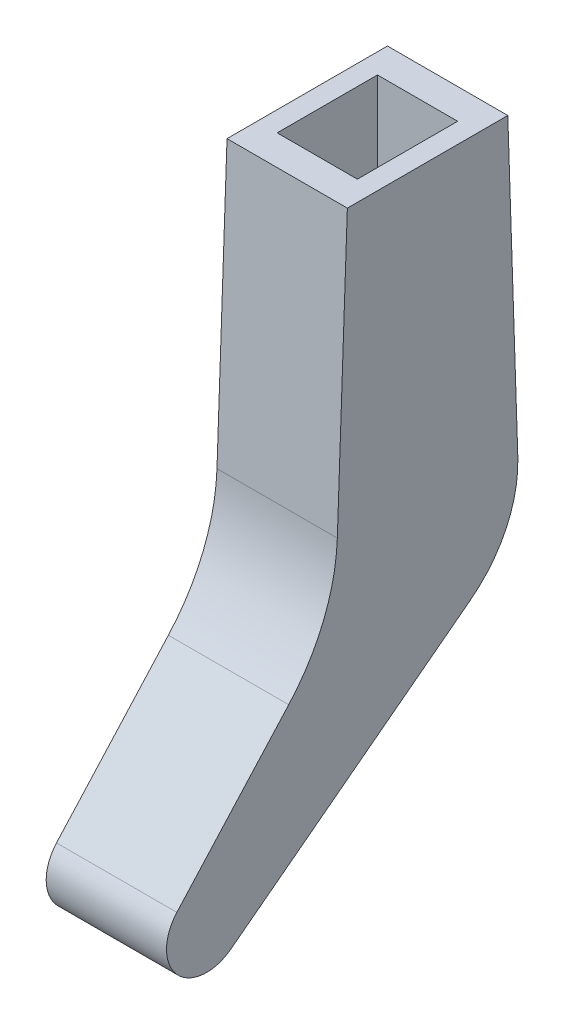
ISO-10303-21;
HEADER;
FILE_DESCRIPTION(('STEP AP214'),'2;1');
FILE_NAME('part.step','',(''),(''),'','','');
FILE_SCHEMA(('AUTOMOTIVE_DESIGN { 1 0 10303 214 1 1 1 1 }'));
ENDSEC;
DATA;
#1=APPLICATION_CONTEXT('core data for automotive mechanical design processes');
#2=APPLICATION_PROTOCOL_DEFINITION('international standard','automotive_design',2000,#1);
#3=PRODUCT_CONTEXT('',#1,'mechanical');
#4=PRODUCT('Part','Part','',(#3));
#5=PRODUCT_RELATED_PRODUCT_CATEGORY('part','',(#4));
#6=PRODUCT_DEFINITION_FORMATION('','',#4);
#7=PRODUCT_DEFINITION_CONTEXT('part definition',#1,'design');
#8=PRODUCT_DEFINITION('design','',#6,#7);
#9=PRODUCT_DEFINITION_SHAPE('','',#8);
#10=(LENGTH_UNIT() NAMED_UNIT(*) SI_UNIT(.MILLI.,.METRE.));
#11=(NAMED_UNIT(*) PLANE_ANGLE_UNIT() SI_UNIT($,.RADIAN.));
#12=(NAMED_UNIT(*) SI_UNIT($,.STERADIAN.) SOLID_ANGLE_UNIT());
#13=UNCERTAINTY_MEASURE_WITH_UNIT(LENGTH_MEASURE(1.E-05),#10,'distance_accuracy_value','');
#14=(GEOMETRIC_REPRESENTATION_CONTEXT(3) GLOBAL_UNCERTAINTY_ASSIGNED_CONTEXT((#13)) GLOBAL_UNIT_ASSIGNED_CONTEXT((#10,
#11,#12)) REPRESENTATION_CONTEXT('',''));
#15=CARTESIAN_POINT('',(0.,0.,0.));
#16=DIRECTION('',(0.,0.,1.));
#17=DIRECTION('',(1.,0.,0.));
#18=AXIS2_PLACEMENT_3D('',#15,#16,#17);
#19=CARTESIAN_POINT('',(4.,-14.7042352060567,-11.203607359622));
#20=DIRECTION('',(0.,0.795421796600104,0.606056239546681));
#21=DIRECTION('',(0.,-0.606056239546681,0.795421796600104));
#22=AXIS2_PLACEMENT_3D('',#19,#20,#21);
#23=PLANE('',#22);
#24=DIRECTION('',(-1.,0.,0.));
#25=VECTOR('',#24,1.);
#26=CARTESIAN_POINT('',(4.,-38.1816871864004,19.6095017468296));
#27=LINE('',#26,#25);
#28=CARTESIAN_POINT('',(6.,-38.1816871864004,19.6095017468296));
#29=VERTEX_POINT('',#28);
#30=CARTESIAN_POINT('',(-6.,-38.1816871864004,19.6095017468296));
#31=VERTEX_POINT('',#30);
#32=EDGE_CURVE('E200',#29,#31,#27,.T.);
#33=ORIENTED_EDGE('',*,*,#32,.T.);
#34=DIRECTION('',(0.,0.606056239546681,-0.795421796600103));
#35=VECTOR('',#34,1.);
#36=CARTESIAN_POINT('',(-6.,-14.7042352060567,-11.203607359622));
#37=LINE('',#36,#35);
#38=CARTESIAN_POINT('',(-6.,-20.,-4.25315215117348));
#39=VERTEX_POINT('',#38);
#40=EDGE_CURVE('E164',#31,#39,#37,.T.);
#41=ORIENTED_EDGE('',*,*,#40,.T.);
#42=DIRECTION('',(-1.,0.,0.));
#43=VECTOR('',#42,1.);
#44=CARTESIAN_POINT('',(4.,-20.,-4.25315215117349));
#45=LINE('',#44,#43);
#46=CARTESIAN_POINT('',(6.,-20.,-4.25315215117349));
#47=VERTEX_POINT('',#46);
#48=EDGE_CURVE('E11',#47,#39,#45,.T.);
#49=ORIENTED_EDGE('',*,*,#48,.F.);
#50=DIRECTION('',(0.,-0.606056239546681,0.795421796600103));
#51=VECTOR('',#50,1.);
#52=CARTESIAN_POINT('',(6.,-14.7042352060567,-11.203607359622));
#53=LINE('',#52,#51);
#54=EDGE_CURVE('E188',#47,#29,#53,.T.);
#55=ORIENTED_EDGE('',*,*,#54,.T.);
#56=EDGE_LOOP('',(#33,#41,#49,#55));
#57=FACE_BOUND('',#56,.T.);
#58=ADVANCED_FACE('F34',(#57),#23,.F.);
#59=CARTESIAN_POINT('',(4.,-10.4019953885707,3.05986165712048));
#60=DIRECTION('',(-1.,0.,0.));
#61=DIRECTION('',(0.,0.,1.));
#62=AXIS2_PLACEMENT_3D('',#59,#60,#61);
#63=CYLINDRICAL_SURFACE('',#62,12.0665597202068);
#64=ORIENTED_EDGE('',*,*,#48,.T.);
#65=CARTESIAN_POINT('',(-6.,-10.4019953885707,3.05986165712048));
#66=DIRECTION('',(1.,0.,0.));
#67=DIRECTION('',(0.,0.,-1.));
#68=AXIS2_PLACEMENT_3D('',#65,#66,#67);
#69=CIRCLE('',#68,12.0665597202068);
#70=CARTESIAN_POINT('',(-6.,-10.,-9.));
#71=VERTEX_POINT('',#70);
#72=EDGE_CURVE('E167',#39,#71,#69,.T.);
#73=ORIENTED_EDGE('',*,*,#72,.T.);
#74=DIRECTION('',(-1.,0.,0.));
#75=VECTOR('',#74,1.);
#76=CARTESIAN_POINT('',(4.,-10.,-9.));
#77=LINE('',#76,#75);
#78=CARTESIAN_POINT('',(6.,-10.,-9.));
#79=VERTEX_POINT('',#78);
#80=EDGE_CURVE('E42',#79,#71,#77,.T.);
#81=ORIENTED_EDGE('',*,*,#80,.F.);
#82=CARTESIAN_POINT('',(6.,-10.4019953885707,3.05986165712048));
#83=DIRECTION('',(1.,0.,0.));
#84=DIRECTION('',(0.,0.,-1.));
#85=AXIS2_PLACEMENT_3D('',#82,#83,#84);
#86=CIRCLE('',#85,12.0665597202068);
#87=EDGE_CURVE('E170',#47,#79,#86,.T.);
#88=ORIENTED_EDGE('',*,*,#87,.F.);
#89=EDGE_LOOP('',(#64,#73,#81,#88));
#90=FACE_BOUND('',#89,.T.);
#91=ADVANCED_FACE('F242',(#90),#63,.T.);
#92=CARTESIAN_POINT('',(4.,0.288568257491676,-8.65704772475028));
#93=DIRECTION('',(0.,-0.0333148302326385,0.999444906979154));
#94=DIRECTION('',(0.,-0.999444906979154,-0.0333148302326385));
#95=AXIS2_PLACEMENT_3D('',#92,#93,#94);
#96=PLANE('',#95);
#97=ORIENTED_EDGE('',*,*,#80,.T.);
#98=DIRECTION('',(0.,0.999444906979154,0.0333148302326385));
#99=VECTOR('',#98,1.);
#100=CARTESIAN_POINT('',(-6.,0.288568257491676,-8.65704772475028));
#101=LINE('',#100,#99);
#102=CARTESIAN_POINT('',(-6.,20.,-8.));
#103=VERTEX_POINT('',#102);
#104=EDGE_CURVE('E143',#71,#103,#101,.T.);
#105=ORIENTED_EDGE('',*,*,#104,.T.);
#106=DIRECTION('',(-1.,0.,0.));
#107=VECTOR('',#106,1.);
#108=CARTESIAN_POINT('',(4.,20.,-8.));
#109=LINE('',#108,#107);
#110=CARTESIAN_POINT('',(6.,20.,-8.));
#111=VERTEX_POINT('',#110);
#112=EDGE_CURVE('E127',#111,#103,#109,.T.);
#113=ORIENTED_EDGE('',*,*,#112,.F.);
#114=DIRECTION('',(0.,-0.999444906979154,-0.0333148302326385));
#115=VECTOR('',#114,1.);
#116=CARTESIAN_POINT('',(6.,0.288568257491676,-8.65704772475028));
#117=LINE('',#116,#115);
#118=EDGE_CURVE('E173',#111,#79,#117,.T.);
#119=ORIENTED_EDGE('',*,*,#118,.T.);
#120=EDGE_LOOP('',(#97,#105,#113,#119));
#121=FACE_BOUND('',#120,.T.);
#122=ADVANCED_FACE('F149',(#121),#96,.F.);
#123=CARTESIAN_POINT('',(4.,0.,-5.));
#124=DIRECTION('',(0.,0.,1.));
#125=DIRECTION('',(1.,0.,0.));
#126=AXIS2_PLACEMENT_3D('',#123,#124,#125);
#127=PLANE('',#126);
#128=DIRECTION('',(0.,1.,0.));
#129=VECTOR('',#128,1.);
#130=CARTESIAN_POINT('',(-4.,0.,-5.));
#131=LINE('',#130,#129);
#132=CARTESIAN_POINT('',(-4.,0.,-5.));
#133=VERTEX_POINT('',#132);
#134=CARTESIAN_POINT('',(-4.,20.,-5.));
#135=VERTEX_POINT('',#134);
#136=EDGE_CURVE('E191',#133,#135,#131,.T.);
#137=ORIENTED_EDGE('',*,*,#136,.F.);
#138=DIRECTION('',(-1.,0.,0.));
#139=VECTOR('',#138,1.);
#140=CARTESIAN_POINT('',(4.,0.,-5.));
#141=LINE('',#140,#139);
#142=CARTESIAN_POINT('',(4.,0.,-5.));
#143=VERTEX_POINT('',#142);
#144=EDGE_CURVE('E219',#143,#133,#141,.T.);
#145=ORIENTED_EDGE('',*,*,#144,.F.);
#146=DIRECTION('',(0.,1.,0.));
#147=VECTOR('',#146,1.);
#148=CARTESIAN_POINT('',(4.,0.,-5.));
#149=LINE('',#148,#147);
#150=CARTESIAN_POINT('',(4.,20.,-5.));
#151=VERTEX_POINT('',#150);
#152=EDGE_CURVE('E193',#143,#151,#149,.T.);
#153=ORIENTED_EDGE('',*,*,#152,.T.);
#154=DIRECTION('',(-1.,0.,0.));
#155=VECTOR('',#154,1.);
#156=CARTESIAN_POINT('',(4.,20.,-5.));
#157=LINE('',#156,#155);
#158=EDGE_CURVE('E72',#151,#135,#157,.T.);
#159=ORIENTED_EDGE('',*,*,#158,.T.);
#160=EDGE_LOOP('',(#137,#145,#153,#159));
#161=FACE_BOUND('',#160,.T.);
#162=ADVANCED_FACE('F223',(#161),#127,.T.);
#163=CARTESIAN_POINT('',(4.,0.,0.));
#164=DIRECTION('',(-1.,0.,0.));
#165=DIRECTION('',(0.,0.,1.));
#166=AXIS2_PLACEMENT_3D('',#163,#164,#165);
#167=CYLINDRICAL_SURFACE('',#166,5.);
#168=CARTESIAN_POINT('',(-4.,0.,0.));
#169=DIRECTION('',(1.,0.,0.));
#170=DIRECTION('',(0.,0.,-1.));
#171=AXIS2_PLACEMENT_3D('',#168,#169,#170);
#172=CIRCLE('',#171,5.);
#173=CARTESIAN_POINT('',(-4.,0.,5.));
#174=VERTEX_POINT('',#173);
#175=EDGE_CURVE('E203',#174,#133,#172,.T.);
#176=ORIENTED_EDGE('',*,*,#175,.F.);
#177=DIRECTION('',(-1.,0.,0.));
#178=VECTOR('',#177,1.);
#179=CARTESIAN_POINT('',(4.,0.,5.));
#180=LINE('',#179,#178);
#181=CARTESIAN_POINT('',(4.,0.,5.));
#182=VERTEX_POINT('',#181);
#183=EDGE_CURVE('E50',#182,#174,#180,.T.);
#184=ORIENTED_EDGE('',*,*,#183,.F.);
#185=CARTESIAN_POINT('',(4.,0.,0.));
#186=DIRECTION('',(1.,0.,0.));
#187=DIRECTION('',(0.,0.,-1.));
#188=AXIS2_PLACEMENT_3D('',#185,#186,#187);
#189=CIRCLE('',#188,5.);
#190=EDGE_CURVE('E195',#182,#143,#189,.T.);
#191=ORIENTED_EDGE('',*,*,#190,.T.);
#192=ORIENTED_EDGE('',*,*,#144,.T.);
#193=EDGE_LOOP('',(#176,#184,#191,#192));
#194=FACE_BOUND('',#193,.T.);
#195=ADVANCED_FACE('F232',(#194),#167,.F.);
#196=CARTESIAN_POINT('',(4.,0.,5.));
#197=DIRECTION('',(0.,0.,1.));
#198=DIRECTION('',(1.,0.,0.));
#199=AXIS2_PLACEMENT_3D('',#196,#197,#198);
#200=PLANE('',#199);
#201=DIRECTION('',(0.,1.,0.));
#202=VECTOR('',#201,1.);
#203=CARTESIAN_POINT('',(-4.,0.,5.));
#204=LINE('',#203,#202);
#205=CARTESIAN_POINT('',(-4.,20.,5.));
#206=VERTEX_POINT('',#205);
#207=EDGE_CURVE('E65',#174,#206,#204,.T.);
#208=ORIENTED_EDGE('',*,*,#207,.T.);
#209=DIRECTION('',(-1.,0.,0.));
#210=VECTOR('',#209,1.);
#211=CARTESIAN_POINT('',(4.,20.,5.));
#212=LINE('',#211,#210);
#213=CARTESIAN_POINT('',(4.,20.,5.));
#214=VERTEX_POINT('',#213);
#215=EDGE_CURVE('E216',#214,#206,#212,.T.);
#216=ORIENTED_EDGE('',*,*,#215,.F.);
#217=DIRECTION('',(0.,1.,0.));
#218=VECTOR('',#217,1.);
#219=CARTESIAN_POINT('',(4.,0.,5.));
#220=LINE('',#219,#218);
#221=EDGE_CURVE('E197',#182,#214,#220,.T.);
#222=ORIENTED_EDGE('',*,*,#221,.F.);
#223=ORIENTED_EDGE('',*,*,#183,.T.);
#224=EDGE_LOOP('',(#208,#216,#222,#223));
#225=FACE_BOUND('',#224,.T.);
#226=ADVANCED_FACE('F228',(#225),#200,.F.);
#227=CARTESIAN_POINT('',(4.,20.,0.));
#228=DIRECTION('',(0.,-1.,0.));
#229=DIRECTION('',(0.,0.,-1.));
#230=AXIS2_PLACEMENT_3D('',#227,#228,#229);
#231=PLANE('',#230);
#232=DIRECTION('',(0.,0.,1.));
#233=VECTOR('',#232,1.);
#234=CARTESIAN_POINT('',(-6.,20.,0.));
#235=LINE('',#234,#233);
#236=CARTESIAN_POINT('',(-6.,20.,8.));
#237=VERTEX_POINT('',#236);
#238=EDGE_CURVE('E130',#103,#237,#235,.T.);
#239=ORIENTED_EDGE('',*,*,#238,.T.);
#240=DIRECTION('',(-1.,0.,0.));
#241=VECTOR('',#240,1.);
#242=CARTESIAN_POINT('',(4.,20.,8.));
#243=LINE('',#242,#241);
#244=CARTESIAN_POINT('',(6.,20.,8.));
#245=VERTEX_POINT('',#244);
#246=EDGE_CURVE('E214',#245,#237,#243,.T.);
#247=ORIENTED_EDGE('',*,*,#246,.F.);
#248=DIRECTION('',(0.,0.,1.));
#249=VECTOR('',#248,1.);
#250=CARTESIAN_POINT('',(6.,20.,0.));
#251=LINE('',#250,#249);
#252=EDGE_CURVE('E132',#111,#245,#251,.T.);
#253=ORIENTED_EDGE('',*,*,#252,.F.);
#254=ORIENTED_EDGE('',*,*,#112,.T.);
#255=EDGE_LOOP('',(#239,#247,#253,#254));
#256=FACE_BOUND('',#255,.T.);
#257=ORIENTED_EDGE('',*,*,#215,.T.);
#258=DIRECTION('',(0.,0.,1.));
#259=VECTOR('',#258,1.);
#260=CARTESIAN_POINT('',(-4.,20.,0.));
#261=LINE('',#260,#259);
#262=EDGE_CURVE('E150',#135,#206,#261,.T.);
#263=ORIENTED_EDGE('',*,*,#262,.F.);
#264=ORIENTED_EDGE('',*,*,#158,.F.);
#265=DIRECTION('',(0.,0.,1.));
#266=VECTOR('',#265,1.);
#267=CARTESIAN_POINT('',(4.,20.,0.));
#268=LINE('',#267,#266);
#269=EDGE_CURVE('E168',#151,#214,#268,.T.);
#270=ORIENTED_EDGE('',*,*,#269,.T.);
#271=EDGE_LOOP('',(#257,#263,#264,#270));
#272=FACE_BOUND('',#271,.T.);
#273=ADVANCED_FACE('F129',(#256,#272),#231,.F.);
#274=CARTESIAN_POINT('',(4.,0.310828025477707,8.7031847133758));
#275=DIRECTION('',(0.,-0.0356915305124124,-0.999362854347549));
#276=DIRECTION('',(0.,0.99936285434755,-0.0356915305124125));
#277=AXIS2_PLACEMENT_3D('',#274,#275,#276);
#278=PLANE('',#277);
#279=ORIENTED_EDGE('',*,*,#246,.T.);
#280=DIRECTION('',(0.,-0.99936285434755,0.0356915305124125));
#281=VECTOR('',#280,1.);
#282=CARTESIAN_POINT('',(-6.,0.310828025477707,8.7031847133758));
#283=LINE('',#282,#281);
#284=CARTESIAN_POINT('',(-6.,-8.,9.));
#285=VERTEX_POINT('',#284);
#286=EDGE_CURVE('E147',#237,#285,#283,.T.);
#287=ORIENTED_EDGE('',*,*,#286,.T.);
#288=DIRECTION('',(-1.,0.,0.));
#289=VECTOR('',#288,1.);
#290=CARTESIAN_POINT('',(4.,-8.,9.));
#291=LINE('',#290,#289);
#292=CARTESIAN_POINT('',(6.,-8.,9.));
#293=VERTEX_POINT('',#292);
#294=EDGE_CURVE('E212',#293,#285,#291,.T.);
#295=ORIENTED_EDGE('',*,*,#294,.F.);
#296=DIRECTION('',(0.,0.99936285434755,-0.0356915305124125));
#297=VECTOR('',#296,1.);
#298=CARTESIAN_POINT('',(6.,0.310828025477707,8.7031847133758));
#299=LINE('',#298,#297);
#300=EDGE_CURVE('E176',#293,#245,#299,.T.);
#301=ORIENTED_EDGE('',*,*,#300,.T.);
#302=EDGE_LOOP('',(#279,#287,#295,#301));
#303=FACE_BOUND('',#302,.T.);
#304=ADVANCED_FACE('F261',(#303),#278,.F.);
#305=CARTESIAN_POINT('',(4.,-7.32698699489372,27.8443641429759));
#306=DIRECTION('',(-1.,0.,0.));
#307=DIRECTION('',(0.,0.,1.));
#308=AXIS2_PLACEMENT_3D('',#305,#306,#307);
#309=CYLINDRICAL_SURFACE('',#308,18.856378402496);
#310=ORIENTED_EDGE('',*,*,#294,.T.);
#311=CARTESIAN_POINT('',(-6.,-7.32698699489372,27.8443641429759));
#312=DIRECTION('',(1.,0.,0.));
#313=DIRECTION('',(0.,0.,-1.));
#314=AXIS2_PLACEMENT_3D('',#311,#312,#313);
#315=CIRCLE('',#314,18.856378402496);
#316=CARTESIAN_POINT('',(-6.,-19.9623314569309,13.8475403324186));
#317=VERTEX_POINT('',#316);
#318=EDGE_CURVE('E156',#317,#285,#315,.T.);
#319=ORIENTED_EDGE('',*,*,#318,.F.);
#320=DIRECTION('',(-1.,0.,0.));
#321=VECTOR('',#320,1.);
#322=CARTESIAN_POINT('',(4.,-19.9623314569309,13.8475403324186));
#323=LINE('',#322,#321);
#324=CARTESIAN_POINT('',(6.,-19.9623314569309,13.8475403324186));
#325=VERTEX_POINT('',#324);
#326=EDGE_CURVE('E210',#325,#317,#323,.T.);
#327=ORIENTED_EDGE('',*,*,#326,.F.);
#328=CARTESIAN_POINT('',(6.,-7.32698699489372,27.8443641429759));
#329=DIRECTION('',(1.,0.,0.));
#330=DIRECTION('',(0.,0.,-1.));
#331=AXIS2_PLACEMENT_3D('',#328,#329,#330);
#332=CIRCLE('',#331,18.856378402496);
#333=EDGE_CURVE('E179',#325,#293,#332,.T.);
#334=ORIENTED_EDGE('',*,*,#333,.T.);
#335=EDGE_LOOP('',(#310,#319,#327,#334));
#336=FACE_BOUND('',#335,.T.);
#337=ADVANCED_FACE('F267',(#336),#309,.F.);
#338=CARTESIAN_POINT('',(4.,-2.07564417186976,-2.2992982782827));
#339=DIRECTION('',(0.,-0.670083310396693,-0.742285899857871));
#340=DIRECTION('',(0.,0.742285899857871,-0.670083310396693));
#341=AXIS2_PLACEMENT_3D('',#338,#339,#340);
#342=PLANE('',#341);
#343=ORIENTED_EDGE('',*,*,#326,.T.);
#344=DIRECTION('',(0.,-0.742285899857871,0.670083310396693));
#345=VECTOR('',#344,1.);
#346=CARTESIAN_POINT('',(-6.,-2.07564417186976,-2.2992982782827));
#347=LINE('',#346,#345);
#348=CARTESIAN_POINT('',(-6.,-32.3196667584132,25.0028703044478));
#349=VERTEX_POINT('',#348);
#350=EDGE_CURVE('E158',#317,#349,#347,.T.);
#351=ORIENTED_EDGE('',*,*,#350,.T.);
#352=DIRECTION('',(-1.,0.,0.));
#353=VECTOR('',#352,1.);
#354=CARTESIAN_POINT('',(4.,-32.3196667584132,25.0028703044478));
#355=LINE('',#354,#353);
#356=CARTESIAN_POINT('',(6.,-32.3196667584132,25.0028703044478));
#357=VERTEX_POINT('',#356);
#358=EDGE_CURVE('E208',#357,#349,#355,.T.);
#359=ORIENTED_EDGE('',*,*,#358,.F.);
#360=DIRECTION('',(0.,0.742285899857871,-0.670083310396693));
#361=VECTOR('',#360,1.);
#362=CARTESIAN_POINT('',(6.,-2.07564417186976,-2.2992982782827));
#363=LINE('',#362,#361);
#364=EDGE_CURVE('E182',#357,#325,#363,.T.);
#365=ORIENTED_EDGE('',*,*,#364,.T.);
#366=EDGE_LOOP('',(#343,#351,#359,#365));
#367=FACE_BOUND('',#366,.T.);
#368=ADVANCED_FACE('F257',(#367),#342,.F.);
#369=CARTESIAN_POINT('',(4.,-35.,22.0337267050163));
#370=DIRECTION('',(-1.,0.,0.));
#371=DIRECTION('',(0.,0.,1.));
#372=AXIS2_PLACEMENT_3D('',#369,#370,#371);
#373=CYLINDRICAL_SURFACE('',#372,4.);
#374=ORIENTED_EDGE('',*,*,#358,.T.);
#375=CARTESIAN_POINT('',(-6.,-35.,22.0337267050163));
#376=DIRECTION('',(1.,0.,0.));
#377=DIRECTION('',(0.,0.,-1.));
#378=AXIS2_PLACEMENT_3D('',#375,#376,#377);
#379=CIRCLE('',#378,4.);
#380=EDGE_CURVE('E161',#349,#31,#379,.T.);
#381=ORIENTED_EDGE('',*,*,#380,.T.);
#382=ORIENTED_EDGE('',*,*,#32,.F.);
#383=CARTESIAN_POINT('',(6.,-35.,22.0337267050163));
#384=DIRECTION('',(1.,0.,0.));
#385=DIRECTION('',(0.,0.,-1.));
#386=AXIS2_PLACEMENT_3D('',#383,#384,#385);
#387=CIRCLE('',#386,4.);
#388=EDGE_CURVE('E185',#357,#29,#387,.T.);
#389=ORIENTED_EDGE('',*,*,#388,.F.);
#390=EDGE_LOOP('',(#374,#381,#382,#389));
#391=FACE_BOUND('',#390,.T.);
#392=ADVANCED_FACE('F254',(#391),#373,.T.);
#393=CARTESIAN_POINT('',(6.,-10.4019953885707,3.05986165712048));
#394=DIRECTION('',(1.,0.,0.));
#395=DIRECTION('',(0.,0.,-1.));
#396=AXIS2_PLACEMENT_3D('',#393,#394,#395);
#397=PLANE('',#396);
#398=ORIENTED_EDGE('',*,*,#87,.T.);
#399=ORIENTED_EDGE('',*,*,#118,.F.);
#400=ORIENTED_EDGE('',*,*,#252,.T.);
#401=ORIENTED_EDGE('',*,*,#300,.F.);
#402=ORIENTED_EDGE('',*,*,#333,.F.);
#403=ORIENTED_EDGE('',*,*,#364,.F.);
#404=ORIENTED_EDGE('',*,*,#388,.T.);
#405=ORIENTED_EDGE('',*,*,#54,.F.);
#406=EDGE_LOOP('',(#398,#399,#400,#401,#402,#403,#404,#405));
#407=FACE_BOUND('',#406,.T.);
#408=ADVANCED_FACE('F264',(#407),#397,.T.);
#409=CARTESIAN_POINT('',(4.,-10.4019953885707,3.05986165712048));
#410=DIRECTION('',(1.,0.,0.));
#411=DIRECTION('',(0.,0.,-1.));
#412=AXIS2_PLACEMENT_3D('',#409,#410,#411);
#413=PLANE('',#412);
#414=ORIENTED_EDGE('',*,*,#152,.F.);
#415=ORIENTED_EDGE('',*,*,#190,.F.);
#416=ORIENTED_EDGE('',*,*,#221,.T.);
#417=ORIENTED_EDGE('',*,*,#269,.F.);
#418=EDGE_LOOP('',(#414,#415,#416,#417));
#419=FACE_BOUND('',#418,.T.);
#420=ADVANCED_FACE('F231',(#419),#413,.F.);
#421=CARTESIAN_POINT('',(-4.,-7.32698699489372,27.8443641429759));
#422=DIRECTION('',(1.,0.,0.));
#423=DIRECTION('',(0.,0.,-1.));
#424=AXIS2_PLACEMENT_3D('',#421,#422,#423);
#425=PLANE('',#424);
#426=ORIENTED_EDGE('',*,*,#207,.F.);
#427=ORIENTED_EDGE('',*,*,#175,.T.);
#428=ORIENTED_EDGE('',*,*,#136,.T.);
#429=ORIENTED_EDGE('',*,*,#262,.T.);
#430=EDGE_LOOP('',(#426,#427,#428,#429));
#431=FACE_BOUND('',#430,.T.);
#432=ADVANCED_FACE('F227',(#431),#425,.T.);
#433=CARTESIAN_POINT('',(-6.,-7.32698699489372,27.8443641429759));
#434=DIRECTION('',(1.,0.,0.));
#435=DIRECTION('',(0.,0.,-1.));
#436=AXIS2_PLACEMENT_3D('',#433,#434,#435);
#437=PLANE('',#436);
#438=ORIENTED_EDGE('',*,*,#104,.F.);
#439=ORIENTED_EDGE('',*,*,#72,.F.);
#440=ORIENTED_EDGE('',*,*,#40,.F.);
#441=ORIENTED_EDGE('',*,*,#380,.F.);
#442=ORIENTED_EDGE('',*,*,#350,.F.);
#443=ORIENTED_EDGE('',*,*,#318,.T.);
#444=ORIENTED_EDGE('',*,*,#286,.F.);
#445=ORIENTED_EDGE('',*,*,#238,.F.);
#446=EDGE_LOOP('',(#438,#439,#440,#441,#442,#443,#444,#445));
#447=FACE_BOUND('',#446,.T.);
#448=ADVANCED_FACE('F141',(#447),#437,.F.);
#449=CLOSED_SHELL('',(#58,#91,#122,#162,#195,#226,#273,#304,#337,#368,#392,#408,#420,#432,#448));
#450=MANIFOLD_SOLID_BREP('B2',#449);
#451=ADVANCED_BREP_SHAPE_REPRESENTATION('',(#18,#450),#14);
#452=SHAPE_DEFINITION_REPRESENTATION(#9,#451);
ENDSEC;
END-ISO-10303-21;
